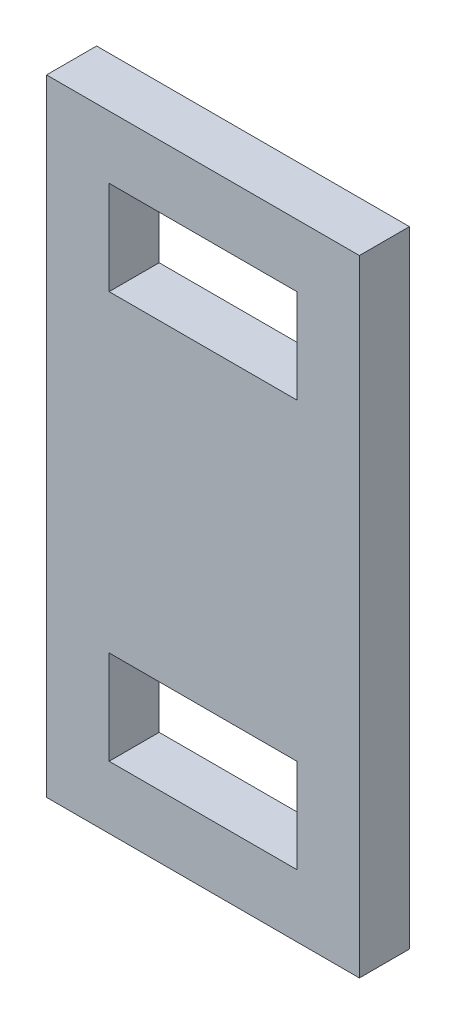
ISO-10303-21;
HEADER;
FILE_DESCRIPTION(('STEP AP214'),'2;1');
FILE_NAME('part.step','',(''),(''),'','','');
FILE_SCHEMA(('AUTOMOTIVE_DESIGN { 1 0 10303 214 1 1 1 1 }'));
ENDSEC;
DATA;
#1=APPLICATION_CONTEXT('core data for automotive mechanical design processes');
#2=APPLICATION_PROTOCOL_DEFINITION('international standard','automotive_design',2000,#1);
#3=PRODUCT_CONTEXT('',#1,'mechanical');
#4=PRODUCT('Part','Part','',(#3));
#5=PRODUCT_RELATED_PRODUCT_CATEGORY('part','',(#4));
#6=PRODUCT_DEFINITION_FORMATION('','',#4);
#7=PRODUCT_DEFINITION_CONTEXT('part definition',#1,'design');
#8=PRODUCT_DEFINITION('design','',#6,#7);
#9=PRODUCT_DEFINITION_SHAPE('','',#8);
#10=(LENGTH_UNIT() NAMED_UNIT(*) SI_UNIT(.MILLI.,.METRE.));
#11=(NAMED_UNIT(*) PLANE_ANGLE_UNIT() SI_UNIT($,.RADIAN.));
#12=(NAMED_UNIT(*) SI_UNIT($,.STERADIAN.) SOLID_ANGLE_UNIT());
#13=UNCERTAINTY_MEASURE_WITH_UNIT(LENGTH_MEASURE(1.E-05),#10,'distance_accuracy_value','');
#14=(GEOMETRIC_REPRESENTATION_CONTEXT(3) GLOBAL_UNCERTAINTY_ASSIGNED_CONTEXT((#13)) GLOBAL_UNIT_ASSIGNED_CONTEXT((#10,
#11,#12)) REPRESENTATION_CONTEXT('',''));
#15=CARTESIAN_POINT('',(0.,0.,0.));
#16=DIRECTION('',(0.,0.,1.));
#17=DIRECTION('',(1.,0.,0.));
#18=AXIS2_PLACEMENT_3D('',#15,#16,#17);
#19=CARTESIAN_POINT('',(0.,0.,0.8));
#20=DIRECTION('',(0.,0.,1.));
#21=DIRECTION('',(1.,0.,0.));
#22=AXIS2_PLACEMENT_3D('',#19,#20,#21);
#23=PLANE('',#22);
#24=DIRECTION('',(0.,-1.,0.));
#25=VECTOR('',#24,1.);
#26=CARTESIAN_POINT('',(-2.5,5.,0.8));
#27=LINE('',#26,#25);
#28=CARTESIAN_POINT('',(-2.5,5.,0.8));
#29=VERTEX_POINT('',#28);
#30=CARTESIAN_POINT('',(-2.5,-5.,0.8));
#31=VERTEX_POINT('',#30);
#32=EDGE_CURVE('E220',#29,#31,#27,.T.);
#33=ORIENTED_EDGE('',*,*,#32,.T.);
#34=DIRECTION('',(1.,0.,0.));
#35=VECTOR('',#34,1.);
#36=CARTESIAN_POINT('',(-2.5,-5.,0.8));
#37=LINE('',#36,#35);
#38=CARTESIAN_POINT('',(2.5,-5.,0.8));
#39=VERTEX_POINT('',#38);
#40=EDGE_CURVE('E224',#31,#39,#37,.T.);
#41=ORIENTED_EDGE('',*,*,#40,.T.);
#42=DIRECTION('',(0.,1.,0.));
#43=VECTOR('',#42,1.);
#44=CARTESIAN_POINT('',(2.5,5.,0.8));
#45=LINE('',#44,#43);
#46=CARTESIAN_POINT('',(2.5,5.,0.8));
#47=VERTEX_POINT('',#46);
#48=EDGE_CURVE('E228',#39,#47,#45,.T.);
#49=ORIENTED_EDGE('',*,*,#48,.T.);
#50=DIRECTION('',(-1.,0.,0.));
#51=VECTOR('',#50,1.);
#52=CARTESIAN_POINT('',(-2.5,5.,0.8));
#53=LINE('',#52,#51);
#54=EDGE_CURVE('E231',#47,#29,#53,.T.);
#55=ORIENTED_EDGE('',*,*,#54,.T.);
#56=EDGE_LOOP('',(#33,#41,#49,#55));
#57=FACE_BOUND('',#56,.T.);
#58=DIRECTION('',(1.,0.,0.));
#59=VECTOR('',#58,1.);
#60=CARTESIAN_POINT('',(-1.5,2.5,0.8));
#61=LINE('',#60,#59);
#62=CARTESIAN_POINT('',(-1.5,2.5,0.8));
#63=VERTEX_POINT('',#62);
#64=CARTESIAN_POINT('',(1.5,2.5,0.8));
#65=VERTEX_POINT('',#64);
#66=EDGE_CURVE('E180',#63,#65,#61,.T.);
#67=ORIENTED_EDGE('',*,*,#66,.F.);
#68=DIRECTION('',(0.,-1.,0.));
#69=VECTOR('',#68,1.);
#70=CARTESIAN_POINT('',(-1.5,4.,0.8));
#71=LINE('',#70,#69);
#72=CARTESIAN_POINT('',(-1.5,4.,0.8));
#73=VERTEX_POINT('',#72);
#74=EDGE_CURVE('E177',#73,#63,#71,.T.);
#75=ORIENTED_EDGE('',*,*,#74,.F.);
#76=DIRECTION('',(-1.,0.,0.));
#77=VECTOR('',#76,1.);
#78=CARTESIAN_POINT('',(-1.5,4.,0.8));
#79=LINE('',#78,#77);
#80=CARTESIAN_POINT('',(1.5,4.,0.8));
#81=VERTEX_POINT('',#80);
#82=EDGE_CURVE('E188',#81,#73,#79,.T.);
#83=ORIENTED_EDGE('',*,*,#82,.F.);
#84=DIRECTION('',(0.,1.,0.));
#85=VECTOR('',#84,1.);
#86=CARTESIAN_POINT('',(1.5,4.,0.8));
#87=LINE('',#86,#85);
#88=EDGE_CURVE('E184',#65,#81,#87,.T.);
#89=ORIENTED_EDGE('',*,*,#88,.F.);
#90=EDGE_LOOP('',(#67,#75,#83,#89));
#91=FACE_BOUND('',#90,.T.);
#92=DIRECTION('',(0.,-1.,0.));
#93=VECTOR('',#92,1.);
#94=CARTESIAN_POINT('',(-1.49999999999993,-2.5,0.8));
#95=LINE('',#94,#93);
#96=CARTESIAN_POINT('',(-1.49999999999993,-2.5,0.8));
#97=VERTEX_POINT('',#96);
#98=CARTESIAN_POINT('',(-1.49999999999993,-4.,0.8));
#99=VERTEX_POINT('',#98);
#100=EDGE_CURVE('E138',#97,#99,#95,.T.);
#101=ORIENTED_EDGE('',*,*,#100,.F.);
#102=DIRECTION('',(-1.,0.,0.));
#103=VECTOR('',#102,1.);
#104=CARTESIAN_POINT('',(-1.49999999999993,-2.5,0.8));
#105=LINE('',#104,#103);
#106=CARTESIAN_POINT('',(1.50000000000007,-2.5,0.8));
#107=VERTEX_POINT('',#106);
#108=EDGE_CURVE('E129',#107,#97,#105,.T.);
#109=ORIENTED_EDGE('',*,*,#108,.F.);
#110=DIRECTION('',(0.,1.,0.));
#111=VECTOR('',#110,1.);
#112=CARTESIAN_POINT('',(1.50000000000007,-2.5,0.8));
#113=LINE('',#112,#111);
#114=CARTESIAN_POINT('',(1.50000000000007,-4.,0.8));
#115=VERTEX_POINT('',#114);
#116=EDGE_CURVE('E155',#115,#107,#113,.T.);
#117=ORIENTED_EDGE('',*,*,#116,.F.);
#118=DIRECTION('',(1.,0.,0.));
#119=VECTOR('',#118,1.);
#120=CARTESIAN_POINT('',(-1.49999999999993,-4.,0.8));
#121=LINE('',#120,#119);
#122=EDGE_CURVE('E151',#99,#115,#121,.T.);
#123=ORIENTED_EDGE('',*,*,#122,.F.);
#124=EDGE_LOOP('',(#101,#109,#117,#123));
#125=FACE_BOUND('',#124,.T.);
#126=ADVANCED_FACE('F39',(#57,#91,#125),#23,.T.);
#127=CARTESIAN_POINT('',(0.,0.,0.));
#128=DIRECTION('',(0.,0.,1.));
#129=DIRECTION('',(1.,0.,0.));
#130=AXIS2_PLACEMENT_3D('',#127,#128,#129);
#131=PLANE('',#130);
#132=DIRECTION('',(0.,-1.,0.));
#133=VECTOR('',#132,1.);
#134=CARTESIAN_POINT('',(-1.5,4.,0.));
#135=LINE('',#134,#133);
#136=CARTESIAN_POINT('',(-1.5,4.,0.));
#137=VERTEX_POINT('',#136);
#138=CARTESIAN_POINT('',(-1.5,2.5,0.));
#139=VERTEX_POINT('',#138);
#140=EDGE_CURVE('E147',#137,#139,#135,.T.);
#141=ORIENTED_EDGE('',*,*,#140,.T.);
#142=DIRECTION('',(1.,0.,0.));
#143=VECTOR('',#142,1.);
#144=CARTESIAN_POINT('',(-1.5,2.5,0.));
#145=LINE('',#144,#143);
#146=CARTESIAN_POINT('',(1.5,2.5,0.));
#147=VERTEX_POINT('',#146);
#148=EDGE_CURVE('E195',#139,#147,#145,.T.);
#149=ORIENTED_EDGE('',*,*,#148,.T.);
#150=DIRECTION('',(0.,1.,0.));
#151=VECTOR('',#150,1.);
#152=CARTESIAN_POINT('',(1.5,4.,0.));
#153=LINE('',#152,#151);
#154=CARTESIAN_POINT('',(1.5,4.,0.));
#155=VERTEX_POINT('',#154);
#156=EDGE_CURVE('E199',#147,#155,#153,.T.);
#157=ORIENTED_EDGE('',*,*,#156,.T.);
#158=DIRECTION('',(-1.,0.,0.));
#159=VECTOR('',#158,1.);
#160=CARTESIAN_POINT('',(-1.5,4.,0.));
#161=LINE('',#160,#159);
#162=EDGE_CURVE('E181',#155,#137,#161,.T.);
#163=ORIENTED_EDGE('',*,*,#162,.T.);
#164=EDGE_LOOP('',(#141,#149,#157,#163));
#165=FACE_BOUND('',#164,.T.);
#166=DIRECTION('',(0.,-1.,0.));
#167=VECTOR('',#166,1.);
#168=CARTESIAN_POINT('',(-2.5,5.,0.));
#169=LINE('',#168,#167);
#170=CARTESIAN_POINT('',(-2.5,5.,0.));
#171=VERTEX_POINT('',#170);
#172=CARTESIAN_POINT('',(-2.5,-5.,0.));
#173=VERTEX_POINT('',#172);
#174=EDGE_CURVE('E219',#171,#173,#169,.T.);
#175=ORIENTED_EDGE('',*,*,#174,.F.);
#176=DIRECTION('',(-1.,0.,0.));
#177=VECTOR('',#176,1.);
#178=CARTESIAN_POINT('',(-2.5,5.,0.));
#179=LINE('',#178,#177);
#180=CARTESIAN_POINT('',(2.5,5.,0.));
#181=VERTEX_POINT('',#180);
#182=EDGE_CURVE('E225',#181,#171,#179,.T.);
#183=ORIENTED_EDGE('',*,*,#182,.F.);
#184=DIRECTION('',(0.,1.,0.));
#185=VECTOR('',#184,1.);
#186=CARTESIAN_POINT('',(2.5,5.,0.));
#187=LINE('',#186,#185);
#188=CARTESIAN_POINT('',(2.5,-5.,0.));
#189=VERTEX_POINT('',#188);
#190=EDGE_CURVE('E241',#189,#181,#187,.T.);
#191=ORIENTED_EDGE('',*,*,#190,.F.);
#192=DIRECTION('',(1.,0.,0.));
#193=VECTOR('',#192,1.);
#194=CARTESIAN_POINT('',(-2.5,-5.,0.));
#195=LINE('',#194,#193);
#196=EDGE_CURVE('E238',#173,#189,#195,.T.);
#197=ORIENTED_EDGE('',*,*,#196,.F.);
#198=EDGE_LOOP('',(#175,#183,#191,#197));
#199=FACE_BOUND('',#198,.T.);
#200=DIRECTION('',(-1.,0.,0.));
#201=VECTOR('',#200,1.);
#202=CARTESIAN_POINT('',(-1.49999999999993,-2.5,0.));
#203=LINE('',#202,#201);
#204=CARTESIAN_POINT('',(1.50000000000007,-2.5,0.));
#205=VERTEX_POINT('',#204);
#206=CARTESIAN_POINT('',(-1.49999999999993,-2.5,0.));
#207=VERTEX_POINT('',#206);
#208=EDGE_CURVE('E63',#205,#207,#203,.T.);
#209=ORIENTED_EDGE('',*,*,#208,.T.);
#210=DIRECTION('',(0.,-1.,0.));
#211=VECTOR('',#210,1.);
#212=CARTESIAN_POINT('',(-1.49999999999993,-2.5,0.));
#213=LINE('',#212,#211);
#214=CARTESIAN_POINT('',(-1.49999999999993,-4.,0.));
#215=VERTEX_POINT('',#214);
#216=EDGE_CURVE('E145',#207,#215,#213,.T.);
#217=ORIENTED_EDGE('',*,*,#216,.T.);
#218=DIRECTION('',(1.,0.,0.));
#219=VECTOR('',#218,1.);
#220=CARTESIAN_POINT('',(-1.49999999999993,-4.,0.));
#221=LINE('',#220,#219);
#222=CARTESIAN_POINT('',(1.50000000000007,-4.,0.));
#223=VERTEX_POINT('',#222);
#224=EDGE_CURVE('E164',#215,#223,#221,.T.);
#225=ORIENTED_EDGE('',*,*,#224,.T.);
#226=DIRECTION('',(0.,1.,0.));
#227=VECTOR('',#226,1.);
#228=CARTESIAN_POINT('',(1.50000000000007,-2.5,0.));
#229=LINE('',#228,#227);
#230=EDGE_CURVE('E139',#223,#205,#229,.T.);
#231=ORIENTED_EDGE('',*,*,#230,.T.);
#232=EDGE_LOOP('',(#209,#217,#225,#231));
#233=FACE_BOUND('',#232,.T.);
#234=ADVANCED_FACE('F264',(#165,#199,#233),#131,.F.);
#235=CARTESIAN_POINT('',(-2.5,5.,0.8));
#236=DIRECTION('',(1.,0.,0.));
#237=DIRECTION('',(0.,1.,0.));
#238=AXIS2_PLACEMENT_3D('',#235,#236,#237);
#239=PLANE('',#238);
#240=ORIENTED_EDGE('',*,*,#174,.T.);
#241=DIRECTION('',(0.,0.,-1.));
#242=VECTOR('',#241,1.);
#243=CARTESIAN_POINT('',(-2.5,-5.,0.8));
#244=LINE('',#243,#242);
#245=EDGE_CURVE('E11',#31,#173,#244,.T.);
#246=ORIENTED_EDGE('',*,*,#245,.F.);
#247=ORIENTED_EDGE('',*,*,#32,.F.);
#248=DIRECTION('',(0.,0.,-1.));
#249=VECTOR('',#248,1.);
#250=CARTESIAN_POINT('',(-2.5,5.,0.8));
#251=LINE('',#250,#249);
#252=EDGE_CURVE('E234',#29,#171,#251,.T.);
#253=ORIENTED_EDGE('',*,*,#252,.T.);
#254=EDGE_LOOP('',(#240,#246,#247,#253));
#255=FACE_BOUND('',#254,.T.);
#256=ADVANCED_FACE('F41',(#255),#239,.F.);
#257=CARTESIAN_POINT('',(-2.5,-5.,0.8));
#258=DIRECTION('',(0.,1.,0.));
#259=DIRECTION('',(0.,0.,1.));
#260=AXIS2_PLACEMENT_3D('',#257,#258,#259);
#261=PLANE('',#260);
#262=ORIENTED_EDGE('',*,*,#196,.T.);
#263=DIRECTION('',(0.,0.,-1.));
#264=VECTOR('',#263,1.);
#265=CARTESIAN_POINT('',(2.5,-5.,0.8));
#266=LINE('',#265,#264);
#267=EDGE_CURVE('E48',#39,#189,#266,.T.);
#268=ORIENTED_EDGE('',*,*,#267,.F.);
#269=ORIENTED_EDGE('',*,*,#40,.F.);
#270=ORIENTED_EDGE('',*,*,#245,.T.);
#271=EDGE_LOOP('',(#262,#268,#269,#270));
#272=FACE_BOUND('',#271,.T.);
#273=ADVANCED_FACE('F275',(#272),#261,.F.);
#274=CARTESIAN_POINT('',(2.5,5.,0.8));
#275=DIRECTION('',(-1.,0.,0.));
#276=DIRECTION('',(0.,-1.,0.));
#277=AXIS2_PLACEMENT_3D('',#274,#275,#276);
#278=PLANE('',#277);
#279=ORIENTED_EDGE('',*,*,#190,.T.);
#280=DIRECTION('',(0.,0.,-1.));
#281=VECTOR('',#280,1.);
#282=CARTESIAN_POINT('',(2.5,5.,0.8));
#283=LINE('',#282,#281);
#284=EDGE_CURVE('E249',#47,#181,#283,.T.);
#285=ORIENTED_EDGE('',*,*,#284,.F.);
#286=ORIENTED_EDGE('',*,*,#48,.F.);
#287=ORIENTED_EDGE('',*,*,#267,.T.);
#288=EDGE_LOOP('',(#279,#285,#286,#287));
#289=FACE_BOUND('',#288,.T.);
#290=ADVANCED_FACE('F258',(#289),#278,.F.);
#291=CARTESIAN_POINT('',(-2.5,5.,0.8));
#292=DIRECTION('',(0.,-1.,0.));
#293=DIRECTION('',(0.,0.,-1.));
#294=AXIS2_PLACEMENT_3D('',#291,#292,#293);
#295=PLANE('',#294);
#296=ORIENTED_EDGE('',*,*,#182,.T.);
#297=ORIENTED_EDGE('',*,*,#252,.F.);
#298=ORIENTED_EDGE('',*,*,#54,.F.);
#299=ORIENTED_EDGE('',*,*,#284,.T.);
#300=EDGE_LOOP('',(#296,#297,#298,#299));
#301=FACE_BOUND('',#300,.T.);
#302=ADVANCED_FACE('F268',(#301),#295,.F.);
#303=CARTESIAN_POINT('',(-1.5,4.,0.8));
#304=DIRECTION('',(1.,0.,0.));
#305=DIRECTION('',(0.,0.,-1.));
#306=AXIS2_PLACEMENT_3D('',#303,#304,#305);
#307=PLANE('',#306);
#308=ORIENTED_EDGE('',*,*,#140,.F.);
#309=DIRECTION('',(0.,0.,-1.));
#310=VECTOR('',#309,1.);
#311=CARTESIAN_POINT('',(-1.5,4.,0.8));
#312=LINE('',#311,#310);
#313=EDGE_CURVE('E191',#73,#137,#312,.T.);
#314=ORIENTED_EDGE('',*,*,#313,.F.);
#315=ORIENTED_EDGE('',*,*,#74,.T.);
#316=DIRECTION('',(0.,0.,-1.));
#317=VECTOR('',#316,1.);
#318=CARTESIAN_POINT('',(-1.5,2.5,0.8));
#319=LINE('',#318,#317);
#320=EDGE_CURVE('E215',#63,#139,#319,.T.);
#321=ORIENTED_EDGE('',*,*,#320,.T.);
#322=EDGE_LOOP('',(#308,#314,#315,#321));
#323=FACE_BOUND('',#322,.T.);
#324=ADVANCED_FACE('F290',(#323),#307,.T.);
#325=CARTESIAN_POINT('',(-1.5,2.5,0.8));
#326=DIRECTION('',(0.,1.,0.));
#327=DIRECTION('',(0.,0.,1.));
#328=AXIS2_PLACEMENT_3D('',#325,#326,#327);
#329=PLANE('',#328);
#330=ORIENTED_EDGE('',*,*,#148,.F.);
#331=ORIENTED_EDGE('',*,*,#320,.F.);
#332=ORIENTED_EDGE('',*,*,#66,.T.);
#333=DIRECTION('',(0.,0.,-1.));
#334=VECTOR('',#333,1.);
#335=CARTESIAN_POINT('',(1.5,2.5,0.8));
#336=LINE('',#335,#334);
#337=EDGE_CURVE('E212',#65,#147,#336,.T.);
#338=ORIENTED_EDGE('',*,*,#337,.T.);
#339=EDGE_LOOP('',(#330,#331,#332,#338));
#340=FACE_BOUND('',#339,.T.);
#341=ADVANCED_FACE('F297',(#340),#329,.T.);
#342=CARTESIAN_POINT('',(1.5,4.,0.8));
#343=DIRECTION('',(-1.,0.,0.));
#344=DIRECTION('',(0.,-1.,0.));
#345=AXIS2_PLACEMENT_3D('',#342,#343,#344);
#346=PLANE('',#345);
#347=ORIENTED_EDGE('',*,*,#156,.F.);
#348=ORIENTED_EDGE('',*,*,#337,.F.);
#349=ORIENTED_EDGE('',*,*,#88,.T.);
#350=DIRECTION('',(0.,0.,-1.));
#351=VECTOR('',#350,1.);
#352=CARTESIAN_POINT('',(1.5,4.,0.8));
#353=LINE('',#352,#351);
#354=EDGE_CURVE('E209',#81,#155,#353,.T.);
#355=ORIENTED_EDGE('',*,*,#354,.T.);
#356=EDGE_LOOP('',(#347,#348,#349,#355));
#357=FACE_BOUND('',#356,.T.);
#358=ADVANCED_FACE('F302',(#357),#346,.T.);
#359=CARTESIAN_POINT('',(-1.5,4.,0.8));
#360=DIRECTION('',(0.,-1.,0.));
#361=DIRECTION('',(0.,0.,-1.));
#362=AXIS2_PLACEMENT_3D('',#359,#360,#361);
#363=PLANE('',#362);
#364=ORIENTED_EDGE('',*,*,#162,.F.);
#365=ORIENTED_EDGE('',*,*,#354,.F.);
#366=ORIENTED_EDGE('',*,*,#82,.T.);
#367=ORIENTED_EDGE('',*,*,#313,.T.);
#368=EDGE_LOOP('',(#364,#365,#366,#367));
#369=FACE_BOUND('',#368,.T.);
#370=ADVANCED_FACE('F309',(#369),#363,.T.);
#371=CARTESIAN_POINT('',(-1.49999999999993,-2.5,0.8));
#372=DIRECTION('',(0.,-1.,0.));
#373=DIRECTION('',(0.,0.,-1.));
#374=AXIS2_PLACEMENT_3D('',#371,#372,#373);
#375=PLANE('',#374);
#376=ORIENTED_EDGE('',*,*,#208,.F.);
#377=DIRECTION('',(0.,0.,-1.));
#378=VECTOR('',#377,1.);
#379=CARTESIAN_POINT('',(1.50000000000007,-2.5,0.8));
#380=LINE('',#379,#378);
#381=EDGE_CURVE('E133',#107,#205,#380,.T.);
#382=ORIENTED_EDGE('',*,*,#381,.F.);
#383=ORIENTED_EDGE('',*,*,#108,.T.);
#384=DIRECTION('',(0.,0.,-1.));
#385=VECTOR('',#384,1.);
#386=CARTESIAN_POINT('',(-1.49999999999993,-2.5,0.8));
#387=LINE('',#386,#385);
#388=EDGE_CURVE('E132',#97,#207,#387,.T.);
#389=ORIENTED_EDGE('',*,*,#388,.T.);
#390=EDGE_LOOP('',(#376,#382,#383,#389));
#391=FACE_BOUND('',#390,.T.);
#392=ADVANCED_FACE('F131',(#391),#375,.T.);
#393=CARTESIAN_POINT('',(-1.49999999999993,-2.5,0.8));
#394=DIRECTION('',(1.,0.,0.));
#395=DIRECTION('',(0.,0.,-1.));
#396=AXIS2_PLACEMENT_3D('',#393,#394,#395);
#397=PLANE('',#396);
#398=ORIENTED_EDGE('',*,*,#216,.F.);
#399=ORIENTED_EDGE('',*,*,#388,.F.);
#400=ORIENTED_EDGE('',*,*,#100,.T.);
#401=DIRECTION('',(0.,0.,-1.));
#402=VECTOR('',#401,1.);
#403=CARTESIAN_POINT('',(-1.49999999999993,-4.,0.8));
#404=LINE('',#403,#402);
#405=EDGE_CURVE('E148',#99,#215,#404,.T.);
#406=ORIENTED_EDGE('',*,*,#405,.T.);
#407=EDGE_LOOP('',(#398,#399,#400,#406));
#408=FACE_BOUND('',#407,.T.);
#409=ADVANCED_FACE('F142',(#408),#397,.T.);
#410=CARTESIAN_POINT('',(-1.49999999999993,-4.,0.8));
#411=DIRECTION('',(0.,1.,0.));
#412=DIRECTION('',(0.,0.,1.));
#413=AXIS2_PLACEMENT_3D('',#410,#411,#412);
#414=PLANE('',#413);
#415=ORIENTED_EDGE('',*,*,#224,.F.);
#416=ORIENTED_EDGE('',*,*,#405,.F.);
#417=ORIENTED_EDGE('',*,*,#122,.T.);
#418=DIRECTION('',(0.,0.,-1.));
#419=VECTOR('',#418,1.);
#420=CARTESIAN_POINT('',(1.50000000000007,-4.,0.8));
#421=LINE('',#420,#419);
#422=EDGE_CURVE('E55',#115,#223,#421,.T.);
#423=ORIENTED_EDGE('',*,*,#422,.T.);
#424=EDGE_LOOP('',(#415,#416,#417,#423));
#425=FACE_BOUND('',#424,.T.);
#426=ADVANCED_FACE('F327',(#425),#414,.T.);
#427=CARTESIAN_POINT('',(1.50000000000007,-2.5,0.8));
#428=DIRECTION('',(-1.,0.,0.));
#429=DIRECTION('',(0.,-1.,0.));
#430=AXIS2_PLACEMENT_3D('',#427,#428,#429);
#431=PLANE('',#430);
#432=ORIENTED_EDGE('',*,*,#230,.F.);
#433=ORIENTED_EDGE('',*,*,#422,.F.);
#434=ORIENTED_EDGE('',*,*,#116,.T.);
#435=ORIENTED_EDGE('',*,*,#381,.T.);
#436=EDGE_LOOP('',(#432,#433,#434,#435));
#437=FACE_BOUND('',#436,.T.);
#438=ADVANCED_FACE('F330',(#437),#431,.T.);
#439=CLOSED_SHELL('',(#126,#234,#256,#273,#290,#302,#324,#341,#358,#370,#392,#409,#426,#438));
#440=MANIFOLD_SOLID_BREP('B2',#439);
#441=ADVANCED_BREP_SHAPE_REPRESENTATION('',(#18,#440),#14);
#442=SHAPE_DEFINITION_REPRESENTATION(#9,#441);
ENDSEC;
END-ISO-10303-21;
